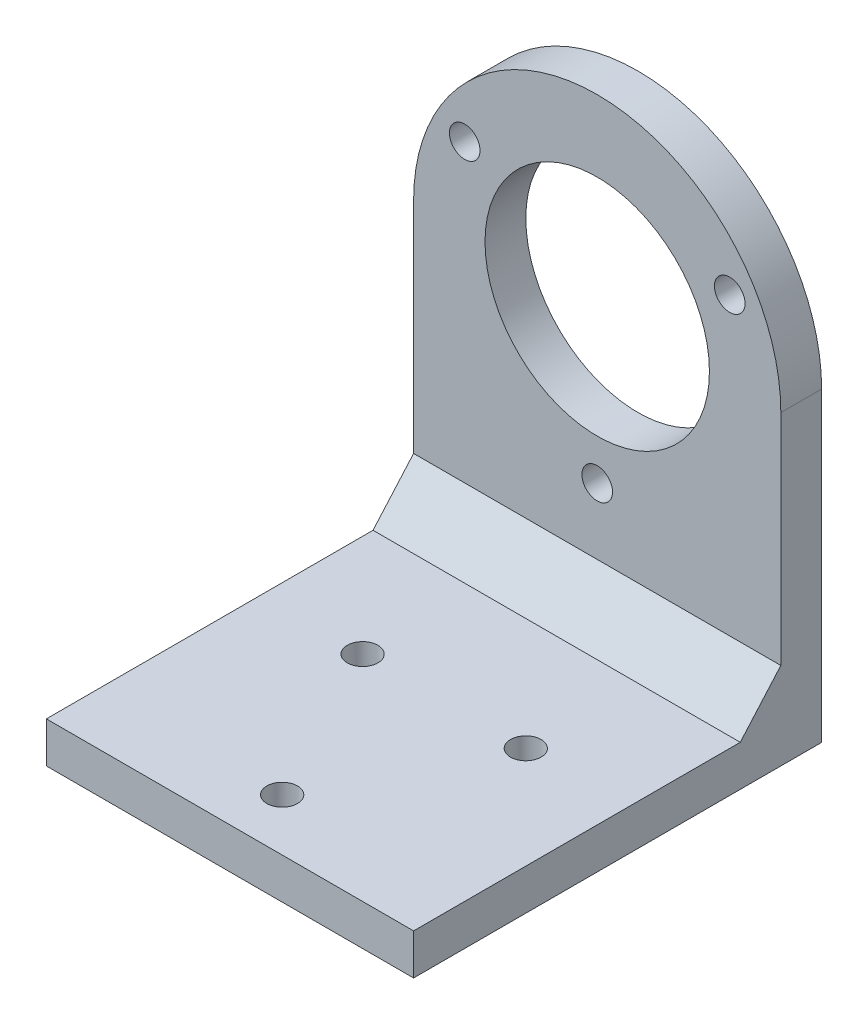
ISO-10303-21;
HEADER;
FILE_DESCRIPTION(('STEP AP214'),'2;1');
FILE_NAME('part.step','',(''),(''),'','','');
FILE_SCHEMA(('AUTOMOTIVE_DESIGN { 1 0 10303 214 1 1 1 1 }'));
ENDSEC;
DATA;
#1=APPLICATION_CONTEXT('core data for automotive mechanical design processes');
#2=APPLICATION_PROTOCOL_DEFINITION('international standard','automotive_design',2000,#1);
#3=PRODUCT_CONTEXT('',#1,'mechanical');
#4=PRODUCT('Part','Part','',(#3));
#5=PRODUCT_RELATED_PRODUCT_CATEGORY('part','',(#4));
#6=PRODUCT_DEFINITION_FORMATION('','',#4);
#7=PRODUCT_DEFINITION_CONTEXT('part definition',#1,'design');
#8=PRODUCT_DEFINITION('design','',#6,#7);
#9=PRODUCT_DEFINITION_SHAPE('','',#8);
#10=(LENGTH_UNIT() NAMED_UNIT(*) SI_UNIT(.MILLI.,.METRE.));
#11=(NAMED_UNIT(*) PLANE_ANGLE_UNIT() SI_UNIT($,.RADIAN.));
#12=(NAMED_UNIT(*) SI_UNIT($,.STERADIAN.) SOLID_ANGLE_UNIT());
#13=UNCERTAINTY_MEASURE_WITH_UNIT(LENGTH_MEASURE(1.E-05),#10,'distance_accuracy_value','');
#14=(GEOMETRIC_REPRESENTATION_CONTEXT(3) GLOBAL_UNCERTAINTY_ASSIGNED_CONTEXT((#13)) GLOBAL_UNIT_ASSIGNED_CONTEXT((#10,
#11,#12)) REPRESENTATION_CONTEXT('',''));
#15=CARTESIAN_POINT('',(0.,0.,0.));
#16=DIRECTION('',(0.,0.,1.));
#17=DIRECTION('',(1.,0.,0.));
#18=AXIS2_PLACEMENT_3D('',#15,#16,#17);
#19=CARTESIAN_POINT('',(-20.9003654854601,21.8309232480534,4.));
#20=DIRECTION('',(0.,0.,1.));
#21=DIRECTION('',(1.,0.,0.));
#22=AXIS2_PLACEMENT_3D('',#19,#20,#21);
#23=PLANE('',#22);
#24=DIRECTION('',(1.,0.,0.));
#25=VECTOR('',#24,1.);
#26=CARTESIAN_POINT('',(-38.9003654854601,0.364546522872464,4.));
#27=LINE('',#26,#25);
#28=CARTESIAN_POINT('',(-38.9003654854601,0.364546522872464,4.));
#29=VERTEX_POINT('',#28);
#30=CARTESIAN_POINT('',(-2.90036548546006,0.364546522872471,4.));
#31=VERTEX_POINT('',#30);
#32=EDGE_CURVE('E56',#29,#31,#27,.T.);
#33=ORIENTED_EDGE('',*,*,#32,.T.);
#34=DIRECTION('',(0.,1.,0.));
#35=VECTOR('',#34,1.);
#36=CARTESIAN_POINT('',(-2.90036548546006,21.8309232480534,4.));
#37=LINE('',#36,#35);
#38=CARTESIAN_POINT('',(-2.90036548546006,21.8309232480534,4.));
#39=VERTEX_POINT('',#38);
#40=EDGE_CURVE('E132',#31,#39,#37,.T.);
#41=ORIENTED_EDGE('',*,*,#40,.T.);
#42=CARTESIAN_POINT('',(-20.9003654854601,21.8309232480534,4.));
#43=DIRECTION('',(0.,0.,1.));
#44=DIRECTION('',(1.,0.,0.));
#45=AXIS2_PLACEMENT_3D('',#42,#43,#44);
#46=CIRCLE('',#45,18.);
#47=CARTESIAN_POINT('',(-38.9003654854601,21.8309232480534,4.));
#48=VERTEX_POINT('',#47);
#49=EDGE_CURVE('E128',#39,#48,#46,.T.);
#50=ORIENTED_EDGE('',*,*,#49,.T.);
#51=DIRECTION('',(0.,-1.,0.));
#52=VECTOR('',#51,1.);
#53=CARTESIAN_POINT('',(-38.9003654854601,21.8309232480534,4.));
#54=LINE('',#53,#52);
#55=EDGE_CURVE('E52',#48,#29,#54,.T.);
#56=ORIENTED_EDGE('',*,*,#55,.T.);
#57=EDGE_LOOP('',(#33,#41,#50,#56));
#58=FACE_BOUND('',#57,.T.);
#59=CARTESIAN_POINT('',(-7.90998442869341,29.3309232480533,4.));
#60=DIRECTION('',(0.,0.,1.));
#61=DIRECTION('',(1.,0.,0.));
#62=AXIS2_PLACEMENT_3D('',#59,#60,#61);
#63=CIRCLE('',#62,1.5);
#64=CARTESIAN_POINT('',(-9.40998442869341,29.3309232480533,4.));
#65=VERTEX_POINT('',#64);
#66=EDGE_CURVE('E114',#65,#65,#63,.F.);
#67=ORIENTED_EDGE('',*,*,#66,.T.);
#68=EDGE_LOOP('',(#67));
#69=FACE_BOUND('',#68,.T.);
#70=CARTESIAN_POINT('',(-33.8907465422266,29.3309232480535,4.));
#71=DIRECTION('',(0.,0.,1.));
#72=DIRECTION('',(1.,0.,0.));
#73=AXIS2_PLACEMENT_3D('',#70,#71,#72);
#74=CIRCLE('',#73,1.5);
#75=CARTESIAN_POINT('',(-35.3907465422266,29.3309232480535,4.));
#76=VERTEX_POINT('',#75);
#77=EDGE_CURVE('E184',#76,#76,#74,.F.);
#78=ORIENTED_EDGE('',*,*,#77,.T.);
#79=EDGE_LOOP('',(#78));
#80=FACE_BOUND('',#79,.T.);
#81=CARTESIAN_POINT('',(-20.9003654854601,6.8309232480534,4.));
#82=DIRECTION('',(0.,0.,1.));
#83=DIRECTION('',(1.,0.,0.));
#84=AXIS2_PLACEMENT_3D('',#81,#82,#83);
#85=CIRCLE('',#84,1.5);
#86=CARTESIAN_POINT('',(-22.4003654854601,6.8309232480534,4.));
#87=VERTEX_POINT('',#86);
#88=EDGE_CURVE('E181',#87,#87,#85,.F.);
#89=ORIENTED_EDGE('',*,*,#88,.T.);
#90=EDGE_LOOP('',(#89));
#91=FACE_BOUND('',#90,.T.);
#92=CARTESIAN_POINT('',(-20.9003654854601,21.8309232480534,4.));
#93=DIRECTION('',(0.,0.,1.));
#94=DIRECTION('',(1.,0.,0.));
#95=AXIS2_PLACEMENT_3D('',#92,#93,#94);
#96=CIRCLE('',#95,11.);
#97=CARTESIAN_POINT('',(-31.9003654854601,21.8309232480534,4.));
#98=VERTEX_POINT('',#97);
#99=EDGE_CURVE('E178',#98,#98,#96,.F.);
#100=ORIENTED_EDGE('',*,*,#99,.T.);
#101=EDGE_LOOP('',(#100));
#102=FACE_BOUND('',#101,.T.);
#103=ADVANCED_FACE('F35',(#58,#69,#80,#91,#102),#23,.T.);
#104=CARTESIAN_POINT('',(-20.9003654854601,21.8309232480534,4.));
#105=DIRECTION('',(0.,0.,-1.));
#106=DIRECTION('',(-1.,0.,0.));
#107=AXIS2_PLACEMENT_3D('',#104,#105,#106);
#108=CYLINDRICAL_SURFACE('',#107,18.);
#109=CARTESIAN_POINT('',(-20.9003654854601,21.8309232480534,0.));
#110=DIRECTION('',(0.,0.,1.));
#111=DIRECTION('',(1.,0.,0.));
#112=AXIS2_PLACEMENT_3D('',#109,#110,#111);
#113=CIRCLE('',#112,18.);
#114=CARTESIAN_POINT('',(-2.90036548546006,21.8309232480534,0.));
#115=VERTEX_POINT('',#114);
#116=CARTESIAN_POINT('',(-38.9003654854601,21.8309232480534,0.));
#117=VERTEX_POINT('',#116);
#118=EDGE_CURVE('E120',#115,#117,#113,.T.);
#119=ORIENTED_EDGE('',*,*,#118,.T.);
#120=DIRECTION('',(0.,0.,-1.));
#121=VECTOR('',#120,1.);
#122=CARTESIAN_POINT('',(-38.9003654854601,21.8309232480534,4.));
#123=LINE('',#122,#121);
#124=EDGE_CURVE('E11',#48,#117,#123,.T.);
#125=ORIENTED_EDGE('',*,*,#124,.F.);
#126=ORIENTED_EDGE('',*,*,#49,.F.);
#127=DIRECTION('',(0.,0.,-1.));
#128=VECTOR('',#127,1.);
#129=CARTESIAN_POINT('',(-2.90036548546006,21.8309232480534,4.));
#130=LINE('',#129,#128);
#131=EDGE_CURVE('E133',#39,#115,#130,.T.);
#132=ORIENTED_EDGE('',*,*,#131,.T.);
#133=EDGE_LOOP('',(#119,#125,#126,#132));
#134=FACE_BOUND('',#133,.T.);
#135=ADVANCED_FACE('F37',(#134),#108,.T.);
#136=CARTESIAN_POINT('',(-38.9003654854601,21.8309232480534,4.));
#137=DIRECTION('',(1.,0.,0.));
#138=DIRECTION('',(0.,0.,-1.));
#139=AXIS2_PLACEMENT_3D('',#136,#137,#138);
#140=PLANE('',#139);
#141=DIRECTION('',(0.,-0.751667643187152,0.659542079162105));
#142=VECTOR('',#141,1.);
#143=CARTESIAN_POINT('',(-38.9003654854601,0.364546522872464,4.));
#144=LINE('',#143,#142);
#145=CARTESIAN_POINT('',(-38.9003654854601,-4.1690767519466,7.97797530319846));
#146=VERTEX_POINT('',#145);
#147=EDGE_CURVE('E205',#29,#146,#144,.T.);
#148=ORIENTED_EDGE('',*,*,#147,.F.);
#149=ORIENTED_EDGE('',*,*,#55,.F.);
#150=ORIENTED_EDGE('',*,*,#124,.T.);
#151=DIRECTION('',(0.,-1.,0.));
#152=VECTOR('',#151,1.);
#153=CARTESIAN_POINT('',(-38.9003654854601,21.8309232480534,0.));
#154=LINE('',#153,#152);
#155=CARTESIAN_POINT('',(-38.9003654854601,-8.1690767519466,0.));
#156=VERTEX_POINT('',#155);
#157=EDGE_CURVE('E123',#117,#156,#154,.T.);
#158=ORIENTED_EDGE('',*,*,#157,.T.);
#159=DIRECTION('',(0.,0.,-1.));
#160=VECTOR('',#159,1.);
#161=CARTESIAN_POINT('',(-38.9003654854601,-8.1690767519466,4.));
#162=LINE('',#161,#160);
#163=CARTESIAN_POINT('',(-38.9003654854601,-8.1690767519466,40.));
#164=VERTEX_POINT('',#163);
#165=EDGE_CURVE('E44',#164,#156,#162,.T.);
#166=ORIENTED_EDGE('',*,*,#165,.F.);
#167=DIRECTION('',(0.,-1.,0.));
#168=VECTOR('',#167,1.);
#169=CARTESIAN_POINT('',(-38.9003654854601,-8.1690767519466,40.));
#170=LINE('',#169,#168);
#171=CARTESIAN_POINT('',(-38.9003654854601,-4.1690767519466,40.));
#172=VERTEX_POINT('',#171);
#173=EDGE_CURVE('E104',#172,#164,#170,.T.);
#174=ORIENTED_EDGE('',*,*,#173,.F.);
#175=DIRECTION('',(0.,0.,-1.));
#176=VECTOR('',#175,1.);
#177=CARTESIAN_POINT('',(-38.9003654854601,-4.1690767519466,40.));
#178=LINE('',#177,#176);
#179=EDGE_CURVE('E100',#172,#146,#178,.T.);
#180=ORIENTED_EDGE('',*,*,#179,.T.);
#181=EDGE_LOOP('',(#148,#149,#150,#158,#166,#174,#180));
#182=FACE_BOUND('',#181,.T.);
#183=ADVANCED_FACE('F208',(#182),#140,.F.);
#184=CARTESIAN_POINT('',(-38.9003654854601,-8.1690767519466,4.));
#185=DIRECTION('',(0.,1.,0.));
#186=DIRECTION('',(0.,0.,1.));
#187=AXIS2_PLACEMENT_3D('',#184,#185,#186);
#188=PLANE('',#187);
#189=CARTESIAN_POINT('',(-12.9003654854601,-8.1690767519466,19.));
#190=DIRECTION('',(0.,1.,0.));
#191=DIRECTION('',(0.,0.,1.));
#192=AXIS2_PLACEMENT_3D('',#189,#190,#191);
#193=CIRCLE('',#192,1.5);
#194=CARTESIAN_POINT('',(-12.9003654854601,-8.1690767519466,20.5));
#195=VERTEX_POINT('',#194);
#196=EDGE_CURVE('E163',#195,#195,#193,.T.);
#197=ORIENTED_EDGE('',*,*,#196,.T.);
#198=EDGE_LOOP('',(#197));
#199=FACE_BOUND('',#198,.T.);
#200=CARTESIAN_POINT('',(-20.90036548546,-8.1690767519466,34.884));
#201=DIRECTION('',(0.,1.,0.));
#202=DIRECTION('',(0.,0.,1.));
#203=AXIS2_PLACEMENT_3D('',#200,#201,#202);
#204=CIRCLE('',#203,1.5);
#205=CARTESIAN_POINT('',(-20.90036548546,-8.1690767519466,36.384));
#206=VERTEX_POINT('',#205);
#207=EDGE_CURVE('E151',#206,#206,#204,.T.);
#208=ORIENTED_EDGE('',*,*,#207,.T.);
#209=EDGE_LOOP('',(#208));
#210=FACE_BOUND('',#209,.T.);
#211=CARTESIAN_POINT('',(-28.90036548546,-8.1690767519466,19.));
#212=DIRECTION('',(0.,1.,0.));
#213=DIRECTION('',(0.,0.,1.));
#214=AXIS2_PLACEMENT_3D('',#211,#212,#213);
#215=CIRCLE('',#214,1.5);
#216=CARTESIAN_POINT('',(-28.90036548546,-8.1690767519466,20.5));
#217=VERTEX_POINT('',#216);
#218=EDGE_CURVE('E147',#217,#217,#215,.T.);
#219=ORIENTED_EDGE('',*,*,#218,.T.);
#220=EDGE_LOOP('',(#219));
#221=FACE_BOUND('',#220,.T.);
#222=DIRECTION('',(1.,0.,0.));
#223=VECTOR('',#222,1.);
#224=CARTESIAN_POINT('',(-38.9003654854601,-8.1690767519466,0.));
#225=LINE('',#224,#223);
#226=CARTESIAN_POINT('',(-2.90036548546006,-8.1690767519466,0.));
#227=VERTEX_POINT('',#226);
#228=EDGE_CURVE('E136',#156,#227,#225,.T.);
#229=ORIENTED_EDGE('',*,*,#228,.T.);
#230=DIRECTION('',(0.,0.,-1.));
#231=VECTOR('',#230,1.);
#232=CARTESIAN_POINT('',(-2.90036548546006,-8.1690767519466,4.));
#233=LINE('',#232,#231);
#234=CARTESIAN_POINT('',(-2.90036548546006,-8.1690767519466,40.));
#235=VERTEX_POINT('',#234);
#236=EDGE_CURVE('E141',#235,#227,#233,.T.);
#237=ORIENTED_EDGE('',*,*,#236,.F.);
#238=DIRECTION('',(1.,0.,0.));
#239=VECTOR('',#238,1.);
#240=CARTESIAN_POINT('',(-2.90036548546006,-8.1690767519466,40.));
#241=LINE('',#240,#239);
#242=EDGE_CURVE('E111',#164,#235,#241,.T.);
#243=ORIENTED_EDGE('',*,*,#242,.F.);
#244=ORIENTED_EDGE('',*,*,#165,.T.);
#245=EDGE_LOOP('',(#229,#237,#243,#244));
#246=FACE_BOUND('',#245,.T.);
#247=ADVANCED_FACE('F191',(#199,#210,#221,#246),#188,.F.);
#248=CARTESIAN_POINT('',(-2.90036548546006,21.8309232480534,4.));
#249=DIRECTION('',(-1.,0.,0.));
#250=DIRECTION('',(0.,-1.,0.));
#251=AXIS2_PLACEMENT_3D('',#248,#249,#250);
#252=PLANE('',#251);
#253=ORIENTED_EDGE('',*,*,#40,.F.);
#254=DIRECTION('',(0.,-0.751667643187152,0.659542079162105));
#255=VECTOR('',#254,1.);
#256=CARTESIAN_POINT('',(-2.90036548546006,0.364546522872472,4.));
#257=LINE('',#256,#255);
#258=CARTESIAN_POINT('',(-2.90036548546006,-4.1690767519466,7.97797530319846));
#259=VERTEX_POINT('',#258);
#260=EDGE_CURVE('E119',#31,#259,#257,.T.);
#261=ORIENTED_EDGE('',*,*,#260,.T.);
#262=DIRECTION('',(0.,0.,-1.));
#263=VECTOR('',#262,1.);
#264=CARTESIAN_POINT('',(-2.90036548546006,-4.1690767519466,40.));
#265=LINE('',#264,#263);
#266=CARTESIAN_POINT('',(-2.90036548546006,-4.1690767519466,40.));
#267=VERTEX_POINT('',#266);
#268=EDGE_CURVE('E97',#267,#259,#265,.T.);
#269=ORIENTED_EDGE('',*,*,#268,.F.);
#270=DIRECTION('',(0.,1.,0.));
#271=VECTOR('',#270,1.);
#272=CARTESIAN_POINT('',(-2.90036548546006,-8.1690767519466,40.));
#273=LINE('',#272,#271);
#274=EDGE_CURVE('E105',#235,#267,#273,.T.);
#275=ORIENTED_EDGE('',*,*,#274,.F.);
#276=ORIENTED_EDGE('',*,*,#236,.T.);
#277=DIRECTION('',(0.,1.,0.));
#278=VECTOR('',#277,1.);
#279=CARTESIAN_POINT('',(-2.90036548546006,21.8309232480534,0.));
#280=LINE('',#279,#278);
#281=EDGE_CURVE('E130',#227,#115,#280,.T.);
#282=ORIENTED_EDGE('',*,*,#281,.T.);
#283=ORIENTED_EDGE('',*,*,#131,.F.);
#284=EDGE_LOOP('',(#253,#261,#269,#275,#276,#282,#283));
#285=FACE_BOUND('',#284,.T.);
#286=ADVANCED_FACE('F117',(#285),#252,.F.);
#287=CARTESIAN_POINT('',(-20.9003654854601,21.8309232480534,0.));
#288=DIRECTION('',(0.,0.,1.));
#289=DIRECTION('',(1.,0.,0.));
#290=AXIS2_PLACEMENT_3D('',#287,#288,#289);
#291=PLANE('',#290);
#292=CARTESIAN_POINT('',(-7.90998442869341,29.3309232480533,0.));
#293=DIRECTION('',(0.,0.,1.));
#294=DIRECTION('',(1.,0.,0.));
#295=AXIS2_PLACEMENT_3D('',#292,#293,#294);
#296=CIRCLE('',#295,1.5);
#297=CARTESIAN_POINT('',(-9.40998442869341,29.3309232480533,0.));
#298=VERTEX_POINT('',#297);
#299=EDGE_CURVE('E166',#298,#298,#296,.T.);
#300=ORIENTED_EDGE('',*,*,#299,.T.);
#301=EDGE_LOOP('',(#300));
#302=FACE_BOUND('',#301,.T.);
#303=CARTESIAN_POINT('',(-33.8907465422266,29.3309232480535,0.));
#304=DIRECTION('',(0.,0.,1.));
#305=DIRECTION('',(1.,0.,0.));
#306=AXIS2_PLACEMENT_3D('',#303,#304,#305);
#307=CIRCLE('',#306,1.5);
#308=CARTESIAN_POINT('',(-35.3907465422266,29.3309232480535,0.));
#309=VERTEX_POINT('',#308);
#310=EDGE_CURVE('E171',#309,#309,#307,.T.);
#311=ORIENTED_EDGE('',*,*,#310,.T.);
#312=EDGE_LOOP('',(#311));
#313=FACE_BOUND('',#312,.T.);
#314=CARTESIAN_POINT('',(-20.9003654854601,6.8309232480534,0.));
#315=DIRECTION('',(0.,0.,1.));
#316=DIRECTION('',(1.,0.,0.));
#317=AXIS2_PLACEMENT_3D('',#314,#315,#316);
#318=CIRCLE('',#317,1.5);
#319=CARTESIAN_POINT('',(-22.4003654854601,6.8309232480534,0.));
#320=VERTEX_POINT('',#319);
#321=EDGE_CURVE('E167',#320,#320,#318,.T.);
#322=ORIENTED_EDGE('',*,*,#321,.T.);
#323=EDGE_LOOP('',(#322));
#324=FACE_BOUND('',#323,.T.);
#325=CARTESIAN_POINT('',(-20.9003654854601,21.8309232480534,0.));
#326=DIRECTION('',(0.,0.,1.));
#327=DIRECTION('',(1.,0.,0.));
#328=AXIS2_PLACEMENT_3D('',#325,#326,#327);
#329=CIRCLE('',#328,11.);
#330=CARTESIAN_POINT('',(-31.9003654854601,21.8309232480534,0.));
#331=VERTEX_POINT('',#330);
#332=EDGE_CURVE('E170',#331,#331,#329,.T.);
#333=ORIENTED_EDGE('',*,*,#332,.T.);
#334=EDGE_LOOP('',(#333));
#335=FACE_BOUND('',#334,.T.);
#336=ORIENTED_EDGE('',*,*,#228,.F.);
#337=ORIENTED_EDGE('',*,*,#157,.F.);
#338=ORIENTED_EDGE('',*,*,#118,.F.);
#339=ORIENTED_EDGE('',*,*,#281,.F.);
#340=EDGE_LOOP('',(#336,#337,#338,#339));
#341=FACE_BOUND('',#340,.T.);
#342=ADVANCED_FACE('F197',(#302,#313,#324,#335,#341),#291,.F.);
#343=CARTESIAN_POINT('',(-2.90036548546006,-4.1690767519466,40.));
#344=DIRECTION('',(0.,-1.,0.));
#345=DIRECTION('',(0.,0.,-1.));
#346=AXIS2_PLACEMENT_3D('',#343,#344,#345);
#347=PLANE('',#346);
#348=CARTESIAN_POINT('',(-12.9003654854601,-4.1690767519466,19.));
#349=DIRECTION('',(0.,-1.,0.));
#350=DIRECTION('',(0.,0.,-1.));
#351=AXIS2_PLACEMENT_3D('',#348,#349,#350);
#352=CIRCLE('',#351,1.5);
#353=CARTESIAN_POINT('',(-12.9003654854601,-4.1690767519466,17.5));
#354=VERTEX_POINT('',#353);
#355=EDGE_CURVE('E39',#354,#354,#352,.T.);
#356=ORIENTED_EDGE('',*,*,#355,.T.);
#357=EDGE_LOOP('',(#356));
#358=FACE_BOUND('',#357,.T.);
#359=CARTESIAN_POINT('',(-20.90036548546,-4.1690767519466,34.884));
#360=DIRECTION('',(0.,-1.,0.));
#361=DIRECTION('',(0.,0.,-1.));
#362=AXIS2_PLACEMENT_3D('',#359,#360,#361);
#363=CIRCLE('',#362,1.5);
#364=CARTESIAN_POINT('',(-20.90036548546,-4.1690767519466,33.384));
#365=VERTEX_POINT('',#364);
#366=EDGE_CURVE('E149',#365,#365,#363,.T.);
#367=ORIENTED_EDGE('',*,*,#366,.T.);
#368=EDGE_LOOP('',(#367));
#369=FACE_BOUND('',#368,.T.);
#370=CARTESIAN_POINT('',(-28.90036548546,-4.1690767519466,19.));
#371=DIRECTION('',(0.,-1.,0.));
#372=DIRECTION('',(0.,0.,-1.));
#373=AXIS2_PLACEMENT_3D('',#370,#371,#372);
#374=CIRCLE('',#373,1.5);
#375=CARTESIAN_POINT('',(-28.90036548546,-4.1690767519466,17.5));
#376=VERTEX_POINT('',#375);
#377=EDGE_CURVE('E145',#376,#376,#374,.T.);
#378=ORIENTED_EDGE('',*,*,#377,.T.);
#379=EDGE_LOOP('',(#378));
#380=FACE_BOUND('',#379,.T.);
#381=ORIENTED_EDGE('',*,*,#268,.T.);
#382=DIRECTION('',(1.,0.,0.));
#383=VECTOR('',#382,1.);
#384=CARTESIAN_POINT('',(-38.9003654854601,-4.16907675194661,7.97797530319846));
#385=LINE('',#384,#383);
#386=EDGE_CURVE('E148',#146,#259,#385,.T.);
#387=ORIENTED_EDGE('',*,*,#386,.F.);
#388=ORIENTED_EDGE('',*,*,#179,.F.);
#389=DIRECTION('',(-1.,0.,0.));
#390=VECTOR('',#389,1.);
#391=CARTESIAN_POINT('',(-2.90036548546006,-4.1690767519466,40.));
#392=LINE('',#391,#390);
#393=EDGE_CURVE('E93',#267,#172,#392,.T.);
#394=ORIENTED_EDGE('',*,*,#393,.F.);
#395=EDGE_LOOP('',(#381,#387,#388,#394));
#396=FACE_BOUND('',#395,.T.);
#397=ADVANCED_FACE('F95',(#358,#369,#380,#396),#347,.F.);
#398=CARTESIAN_POINT('',(0.,0.,40.));
#399=DIRECTION('',(0.,0.,1.));
#400=DIRECTION('',(1.,0.,0.));
#401=AXIS2_PLACEMENT_3D('',#398,#399,#400);
#402=PLANE('',#401);
#403=ORIENTED_EDGE('',*,*,#274,.T.);
#404=ORIENTED_EDGE('',*,*,#393,.T.);
#405=ORIENTED_EDGE('',*,*,#173,.T.);
#406=ORIENTED_EDGE('',*,*,#242,.T.);
#407=EDGE_LOOP('',(#403,#404,#405,#406));
#408=FACE_BOUND('',#407,.T.);
#409=ADVANCED_FACE('F109',(#408),#402,.T.);
#410=CARTESIAN_POINT('',(-20.9003654854601,21.8309232480534,22.));
#411=DIRECTION('',(0.,0.,-1.));
#412=DIRECTION('',(-1.,0.,0.));
#413=AXIS2_PLACEMENT_3D('',#410,#411,#412);
#414=CYLINDRICAL_SURFACE('',#413,11.);
#415=CARTESIAN_POINT('',(-31.9003654854601,21.8309232480534,4.));
#416=CARTESIAN_POINT('',(-31.9003654854601,21.8309232480534,3.95833333333333));
#417=CARTESIAN_POINT('',(-31.9003654854601,21.8309232480534,3.91666666666667));
#418=CARTESIAN_POINT('',(-31.9003654854601,21.8309232480534,3.83333333333333));
#419=CARTESIAN_POINT('',(-31.9003654854601,21.8309232480534,3.79166666666667));
#420=CARTESIAN_POINT('',(-31.9003654854601,21.8309232480534,3.70833333333333));
#421=CARTESIAN_POINT('',(-31.9003654854601,21.8309232480534,3.66666666666667));
#422=CARTESIAN_POINT('',(-31.9003654854601,21.8309232480534,3.58333333333333));
#423=CARTESIAN_POINT('',(-31.9003654854601,21.8309232480534,3.54166666666667));
#424=CARTESIAN_POINT('',(-31.9003654854601,21.8309232480534,3.45833333333333));
#425=CARTESIAN_POINT('',(-31.9003654854601,21.8309232480534,3.41666666666667));
#426=CARTESIAN_POINT('',(-31.9003654854601,21.8309232480534,3.33333333333333));
#427=CARTESIAN_POINT('',(-31.9003654854601,21.8309232480534,3.29166666666667));
#428=CARTESIAN_POINT('',(-31.9003654854601,21.8309232480534,3.20833333333333));
#429=CARTESIAN_POINT('',(-31.9003654854601,21.8309232480534,3.16666666666667));
#430=CARTESIAN_POINT('',(-31.9003654854601,21.8309232480534,3.08333333333333));
#431=CARTESIAN_POINT('',(-31.9003654854601,21.8309232480534,3.04166666666667));
#432=CARTESIAN_POINT('',(-31.9003654854601,21.8309232480534,2.95833333333333));
#433=CARTESIAN_POINT('',(-31.9003654854601,21.8309232480534,2.91666666666667));
#434=CARTESIAN_POINT('',(-31.9003654854601,21.8309232480534,2.83333333333333));
#435=CARTESIAN_POINT('',(-31.9003654854601,21.8309232480534,2.79166666666667));
#436=CARTESIAN_POINT('',(-31.9003654854601,21.8309232480534,2.70833333333333));
#437=CARTESIAN_POINT('',(-31.9003654854601,21.8309232480534,2.66666666666667));
#438=CARTESIAN_POINT('',(-31.9003654854601,21.8309232480534,2.58333333333333));
#439=CARTESIAN_POINT('',(-31.9003654854601,21.8309232480534,2.54166666666667));
#440=CARTESIAN_POINT('',(-31.9003654854601,21.8309232480534,2.45833333333333));
#441=CARTESIAN_POINT('',(-31.9003654854601,21.8309232480534,2.41666666666667));
#442=CARTESIAN_POINT('',(-31.9003654854601,21.8309232480534,2.33333333333333));
#443=CARTESIAN_POINT('',(-31.9003654854601,21.8309232480534,2.29166666666667));
#444=CARTESIAN_POINT('',(-31.9003654854601,21.8309232480534,2.20833333333333));
#445=CARTESIAN_POINT('',(-31.9003654854601,21.8309232480534,2.16666666666667));
#446=CARTESIAN_POINT('',(-31.9003654854601,21.8309232480534,2.08333333333333));
#447=CARTESIAN_POINT('',(-31.9003654854601,21.8309232480534,2.04166666666667));
#448=CARTESIAN_POINT('',(-31.9003654854601,21.8309232480534,1.95833333333333));
#449=CARTESIAN_POINT('',(-31.9003654854601,21.8309232480534,1.91666666666666));
#450=CARTESIAN_POINT('',(-31.9003654854601,21.8309232480534,1.83333333333333));
#451=CARTESIAN_POINT('',(-31.9003654854601,21.8309232480534,1.79166666666666));
#452=CARTESIAN_POINT('',(-31.9003654854601,21.8309232480534,1.70833333333333));
#453=CARTESIAN_POINT('',(-31.9003654854601,21.8309232480534,1.66666666666666));
#454=CARTESIAN_POINT('',(-31.9003654854601,21.8309232480534,1.58333333333333));
#455=CARTESIAN_POINT('',(-31.9003654854601,21.8309232480534,1.54166666666666));
#456=CARTESIAN_POINT('',(-31.9003654854601,21.8309232480534,1.45833333333333));
#457=CARTESIAN_POINT('',(-31.9003654854601,21.8309232480534,1.41666666666666));
#458=CARTESIAN_POINT('',(-31.9003654854601,21.8309232480534,1.33333333333333));
#459=CARTESIAN_POINT('',(-31.9003654854601,21.8309232480534,1.29166666666666));
#460=CARTESIAN_POINT('',(-31.9003654854601,21.8309232480534,1.20833333333333));
#461=CARTESIAN_POINT('',(-31.9003654854601,21.8309232480534,1.16666666666666));
#462=CARTESIAN_POINT('',(-31.9003654854601,21.8309232480534,1.08333333333333));
#463=CARTESIAN_POINT('',(-31.9003654854601,21.8309232480534,1.04166666666666));
#464=CARTESIAN_POINT('',(-31.9003654854601,21.8309232480534,0.958333333333331));
#465=CARTESIAN_POINT('',(-31.9003654854601,21.8309232480534,0.916666666666664));
#466=CARTESIAN_POINT('',(-31.9003654854601,21.8309232480534,0.833333333333331));
#467=CARTESIAN_POINT('',(-31.9003654854601,21.8309232480534,0.791666666666664));
#468=CARTESIAN_POINT('',(-31.9003654854601,21.8309232480534,0.70833333333333));
#469=CARTESIAN_POINT('',(-31.9003654854601,21.8309232480534,0.666666666666664));
#470=CARTESIAN_POINT('',(-31.9003654854601,21.8309232480534,0.58333333333333));
#471=CARTESIAN_POINT('',(-31.9003654854601,21.8309232480534,0.541666666666664));
#472=CARTESIAN_POINT('',(-31.9003654854601,21.8309232480534,0.45833333333333));
#473=CARTESIAN_POINT('',(-31.9003654854601,21.8309232480534,0.416666666666664));
#474=CARTESIAN_POINT('',(-31.9003654854601,21.8309232480534,0.33333333333333));
#475=CARTESIAN_POINT('',(-31.9003654854601,21.8309232480534,0.291666666666663));
#476=CARTESIAN_POINT('',(-31.9003654854601,21.8309232480534,0.20833333333333));
#477=CARTESIAN_POINT('',(-31.9003654854601,21.8309232480534,0.166666666666663));
#478=CARTESIAN_POINT('',(-31.9003654854601,21.8309232480534,0.0833333333333299));
#479=CARTESIAN_POINT('',(-31.9003654854601,21.8309232480534,0.0416666666666632));
#480=CARTESIAN_POINT('',(-31.9003654854601,21.8309232480534,0.));
#481=B_SPLINE_CURVE_WITH_KNOTS('',3,(#415,#416,#417,#418,#419,#420,#421,#422,#423,#424,#425,
#426,#427,#428,#429,#430,#431,#432,#433,#434,#435,#436,#437,#438,#439,#440,#441,#442,#443,#444,
#445,#446,#447,#448,#449,#450,#451,#452,#453,#454,#455,#456,#457,#458,#459,#460,#461,#462,#463,
#464,#465,#466,#467,#468,#469,#470,#471,#472,#473,#474,#475,#476,#477,#478,#479,#480),
.UNSPECIFIED.,.F.,.F.,(4,2,2,2,2,2,2,2,2,2,2,2,2,2,2,2,2,2,2,2,2,2,2,2,2,2,2,2,2,2,2,2,4),(0.,
0.125,0.25,0.375,0.5,0.625000000000001,0.750000000000001,0.875000000000001,1.,1.125,1.25,1.375,
1.5,1.625,1.75,1.875,2.,2.125,2.25,2.375,2.5,2.625,2.75,2.875,3.,3.125,3.25,3.375,3.5,3.625,
3.75,3.875,4.),.UNSPECIFIED.);
#482=EDGE_CURVE('BSEAM220',#98,#331,#481,.T.);
#483=ORIENTED_EDGE('',*,*,#99,.F.);
#484=ORIENTED_EDGE('',*,*,#332,.F.);
#485=ORIENTED_EDGE('',*,*,#482,.T.);
#486=ORIENTED_EDGE('',*,*,#482,.F.);
#487=EDGE_LOOP('',(#483,#485,#484,#486));
#488=FACE_BOUND('',#487,.T.);
#489=ADVANCED_FACE('F220',(#488),#414,.F.);
#490=CARTESIAN_POINT('',(-20.9003654854601,6.8309232480534,22.));
#491=DIRECTION('',(0.,0.,-1.));
#492=DIRECTION('',(-1.,0.,0.));
#493=AXIS2_PLACEMENT_3D('',#490,#491,#492);
#494=CYLINDRICAL_SURFACE('',#493,1.5);
#495=CARTESIAN_POINT('',(-22.4003654854601,6.8309232480534,4.));
#496=CARTESIAN_POINT('',(-22.4003654854601,6.8309232480534,3.95833333333333));
#497=CARTESIAN_POINT('',(-22.4003654854601,6.8309232480534,3.91666666666667));
#498=CARTESIAN_POINT('',(-22.4003654854601,6.8309232480534,3.83333333333333));
#499=CARTESIAN_POINT('',(-22.4003654854601,6.8309232480534,3.79166666666667));
#500=CARTESIAN_POINT('',(-22.4003654854601,6.8309232480534,3.70833333333333));
#501=CARTESIAN_POINT('',(-22.4003654854601,6.8309232480534,3.66666666666667));
#502=CARTESIAN_POINT('',(-22.4003654854601,6.8309232480534,3.58333333333333));
#503=CARTESIAN_POINT('',(-22.4003654854601,6.8309232480534,3.54166666666667));
#504=CARTESIAN_POINT('',(-22.4003654854601,6.8309232480534,3.45833333333333));
#505=CARTESIAN_POINT('',(-22.4003654854601,6.8309232480534,3.41666666666667));
#506=CARTESIAN_POINT('',(-22.4003654854601,6.8309232480534,3.33333333333333));
#507=CARTESIAN_POINT('',(-22.4003654854601,6.8309232480534,3.29166666666667));
#508=CARTESIAN_POINT('',(-22.4003654854601,6.8309232480534,3.20833333333333));
#509=CARTESIAN_POINT('',(-22.4003654854601,6.8309232480534,3.16666666666667));
#510=CARTESIAN_POINT('',(-22.4003654854601,6.8309232480534,3.08333333333333));
#511=CARTESIAN_POINT('',(-22.4003654854601,6.8309232480534,3.04166666666667));
#512=CARTESIAN_POINT('',(-22.4003654854601,6.8309232480534,2.95833333333333));
#513=CARTESIAN_POINT('',(-22.4003654854601,6.8309232480534,2.91666666666667));
#514=CARTESIAN_POINT('',(-22.4003654854601,6.8309232480534,2.83333333333333));
#515=CARTESIAN_POINT('',(-22.4003654854601,6.8309232480534,2.79166666666667));
#516=CARTESIAN_POINT('',(-22.4003654854601,6.8309232480534,2.70833333333333));
#517=CARTESIAN_POINT('',(-22.4003654854601,6.8309232480534,2.66666666666667));
#518=CARTESIAN_POINT('',(-22.4003654854601,6.8309232480534,2.58333333333333));
#519=CARTESIAN_POINT('',(-22.4003654854601,6.8309232480534,2.54166666666667));
#520=CARTESIAN_POINT('',(-22.4003654854601,6.8309232480534,2.45833333333333));
#521=CARTESIAN_POINT('',(-22.4003654854601,6.8309232480534,2.41666666666667));
#522=CARTESIAN_POINT('',(-22.4003654854601,6.8309232480534,2.33333333333333));
#523=CARTESIAN_POINT('',(-22.4003654854601,6.8309232480534,2.29166666666667));
#524=CARTESIAN_POINT('',(-22.4003654854601,6.8309232480534,2.20833333333333));
#525=CARTESIAN_POINT('',(-22.4003654854601,6.8309232480534,2.16666666666667));
#526=CARTESIAN_POINT('',(-22.4003654854601,6.8309232480534,2.08333333333333));
#527=CARTESIAN_POINT('',(-22.4003654854601,6.8309232480534,2.04166666666667));
#528=CARTESIAN_POINT('',(-22.4003654854601,6.8309232480534,1.95833333333333));
#529=CARTESIAN_POINT('',(-22.4003654854601,6.8309232480534,1.91666666666666));
#530=CARTESIAN_POINT('',(-22.4003654854601,6.8309232480534,1.83333333333333));
#531=CARTESIAN_POINT('',(-22.4003654854601,6.8309232480534,1.79166666666666));
#532=CARTESIAN_POINT('',(-22.4003654854601,6.8309232480534,1.70833333333333));
#533=CARTESIAN_POINT('',(-22.4003654854601,6.8309232480534,1.66666666666666));
#534=CARTESIAN_POINT('',(-22.4003654854601,6.8309232480534,1.58333333333333));
#535=CARTESIAN_POINT('',(-22.4003654854601,6.8309232480534,1.54166666666666));
#536=CARTESIAN_POINT('',(-22.4003654854601,6.8309232480534,1.45833333333333));
#537=CARTESIAN_POINT('',(-22.4003654854601,6.8309232480534,1.41666666666666));
#538=CARTESIAN_POINT('',(-22.4003654854601,6.8309232480534,1.33333333333333));
#539=CARTESIAN_POINT('',(-22.4003654854601,6.8309232480534,1.29166666666666));
#540=CARTESIAN_POINT('',(-22.4003654854601,6.8309232480534,1.20833333333333));
#541=CARTESIAN_POINT('',(-22.4003654854601,6.8309232480534,1.16666666666666));
#542=CARTESIAN_POINT('',(-22.4003654854601,6.8309232480534,1.08333333333333));
#543=CARTESIAN_POINT('',(-22.4003654854601,6.8309232480534,1.04166666666666));
#544=CARTESIAN_POINT('',(-22.4003654854601,6.8309232480534,0.958333333333331));
#545=CARTESIAN_POINT('',(-22.4003654854601,6.8309232480534,0.916666666666664));
#546=CARTESIAN_POINT('',(-22.4003654854601,6.8309232480534,0.833333333333331));
#547=CARTESIAN_POINT('',(-22.4003654854601,6.8309232480534,0.791666666666664));
#548=CARTESIAN_POINT('',(-22.4003654854601,6.8309232480534,0.70833333333333));
#549=CARTESIAN_POINT('',(-22.4003654854601,6.8309232480534,0.666666666666664));
#550=CARTESIAN_POINT('',(-22.4003654854601,6.8309232480534,0.58333333333333));
#551=CARTESIAN_POINT('',(-22.4003654854601,6.8309232480534,0.541666666666664));
#552=CARTESIAN_POINT('',(-22.4003654854601,6.8309232480534,0.45833333333333));
#553=CARTESIAN_POINT('',(-22.4003654854601,6.8309232480534,0.416666666666664));
#554=CARTESIAN_POINT('',(-22.4003654854601,6.8309232480534,0.33333333333333));
#555=CARTESIAN_POINT('',(-22.4003654854601,6.8309232480534,0.291666666666663));
#556=CARTESIAN_POINT('',(-22.4003654854601,6.8309232480534,0.20833333333333));
#557=CARTESIAN_POINT('',(-22.4003654854601,6.8309232480534,0.166666666666663));
#558=CARTESIAN_POINT('',(-22.4003654854601,6.8309232480534,0.0833333333333299));
#559=CARTESIAN_POINT('',(-22.4003654854601,6.8309232480534,0.0416666666666632));
#560=CARTESIAN_POINT('',(-22.4003654854601,6.8309232480534,0.));
#561=B_SPLINE_CURVE_WITH_KNOTS('',3,(#495,#496,#497,#498,#499,#500,#501,#502,#503,#504,#505,
#506,#507,#508,#509,#510,#511,#512,#513,#514,#515,#516,#517,#518,#519,#520,#521,#522,#523,#524,
#525,#526,#527,#528,#529,#530,#531,#532,#533,#534,#535,#536,#537,#538,#539,#540,#541,#542,#543,
#544,#545,#546,#547,#548,#549,#550,#551,#552,#553,#554,#555,#556,#557,#558,#559,#560),
.UNSPECIFIED.,.F.,.F.,(4,2,2,2,2,2,2,2,2,2,2,2,2,2,2,2,2,2,2,2,2,2,2,2,2,2,2,2,2,2,2,2,4),(0.,
0.125,0.25,0.375,0.5,0.625000000000001,0.750000000000001,0.875000000000001,1.,1.125,1.25,1.375,
1.5,1.625,1.75,1.875,2.,2.125,2.25,2.375,2.5,2.625,2.75,2.875,3.,3.125,3.25,3.375,3.5,3.625,
3.75,3.875,4.),.UNSPECIFIED.);
#562=EDGE_CURVE('BSEAM223',#87,#320,#561,.T.);
#563=ORIENTED_EDGE('',*,*,#88,.F.);
#564=ORIENTED_EDGE('',*,*,#321,.F.);
#565=ORIENTED_EDGE('',*,*,#562,.T.);
#566=ORIENTED_EDGE('',*,*,#562,.F.);
#567=EDGE_LOOP('',(#563,#565,#564,#566));
#568=FACE_BOUND('',#567,.T.);
#569=ADVANCED_FACE('F223',(#568),#494,.F.);
#570=CARTESIAN_POINT('',(-33.8907465422266,29.3309232480535,22.));
#571=DIRECTION('',(0.,0.,-1.));
#572=DIRECTION('',(-1.,0.,0.));
#573=AXIS2_PLACEMENT_3D('',#570,#571,#572);
#574=CYLINDRICAL_SURFACE('',#573,1.5);
#575=CARTESIAN_POINT('',(-35.3907465422266,29.3309232480535,4.));
#576=CARTESIAN_POINT('',(-35.3907465422266,29.3309232480535,3.95833333333333));
#577=CARTESIAN_POINT('',(-35.3907465422266,29.3309232480535,3.91666666666667));
#578=CARTESIAN_POINT('',(-35.3907465422266,29.3309232480535,3.83333333333333));
#579=CARTESIAN_POINT('',(-35.3907465422266,29.3309232480535,3.79166666666667));
#580=CARTESIAN_POINT('',(-35.3907465422266,29.3309232480535,3.70833333333333));
#581=CARTESIAN_POINT('',(-35.3907465422266,29.3309232480535,3.66666666666667));
#582=CARTESIAN_POINT('',(-35.3907465422266,29.3309232480535,3.58333333333333));
#583=CARTESIAN_POINT('',(-35.3907465422266,29.3309232480535,3.54166666666667));
#584=CARTESIAN_POINT('',(-35.3907465422266,29.3309232480535,3.45833333333333));
#585=CARTESIAN_POINT('',(-35.3907465422266,29.3309232480535,3.41666666666667));
#586=CARTESIAN_POINT('',(-35.3907465422266,29.3309232480535,3.33333333333333));
#587=CARTESIAN_POINT('',(-35.3907465422266,29.3309232480535,3.29166666666667));
#588=CARTESIAN_POINT('',(-35.3907465422266,29.3309232480535,3.20833333333333));
#589=CARTESIAN_POINT('',(-35.3907465422266,29.3309232480535,3.16666666666667));
#590=CARTESIAN_POINT('',(-35.3907465422266,29.3309232480535,3.08333333333333));
#591=CARTESIAN_POINT('',(-35.3907465422266,29.3309232480535,3.04166666666667));
#592=CARTESIAN_POINT('',(-35.3907465422266,29.3309232480535,2.95833333333333));
#593=CARTESIAN_POINT('',(-35.3907465422266,29.3309232480535,2.91666666666667));
#594=CARTESIAN_POINT('',(-35.3907465422266,29.3309232480535,2.83333333333333));
#595=CARTESIAN_POINT('',(-35.3907465422266,29.3309232480535,2.79166666666667));
#596=CARTESIAN_POINT('',(-35.3907465422266,29.3309232480535,2.70833333333333));
#597=CARTESIAN_POINT('',(-35.3907465422266,29.3309232480535,2.66666666666667));
#598=CARTESIAN_POINT('',(-35.3907465422266,29.3309232480535,2.58333333333333));
#599=CARTESIAN_POINT('',(-35.3907465422266,29.3309232480535,2.54166666666667));
#600=CARTESIAN_POINT('',(-35.3907465422266,29.3309232480535,2.45833333333333));
#601=CARTESIAN_POINT('',(-35.3907465422266,29.3309232480535,2.41666666666667));
#602=CARTESIAN_POINT('',(-35.3907465422266,29.3309232480535,2.33333333333333));
#603=CARTESIAN_POINT('',(-35.3907465422266,29.3309232480535,2.29166666666667));
#604=CARTESIAN_POINT('',(-35.3907465422266,29.3309232480535,2.20833333333333));
#605=CARTESIAN_POINT('',(-35.3907465422266,29.3309232480535,2.16666666666667));
#606=CARTESIAN_POINT('',(-35.3907465422266,29.3309232480535,2.08333333333333));
#607=CARTESIAN_POINT('',(-35.3907465422266,29.3309232480535,2.04166666666667));
#608=CARTESIAN_POINT('',(-35.3907465422266,29.3309232480535,1.95833333333333));
#609=CARTESIAN_POINT('',(-35.3907465422266,29.3309232480535,1.91666666666666));
#610=CARTESIAN_POINT('',(-35.3907465422266,29.3309232480535,1.83333333333333));
#611=CARTESIAN_POINT('',(-35.3907465422266,29.3309232480535,1.79166666666666));
#612=CARTESIAN_POINT('',(-35.3907465422266,29.3309232480535,1.70833333333333));
#613=CARTESIAN_POINT('',(-35.3907465422266,29.3309232480535,1.66666666666666));
#614=CARTESIAN_POINT('',(-35.3907465422266,29.3309232480535,1.58333333333333));
#615=CARTESIAN_POINT('',(-35.3907465422266,29.3309232480535,1.54166666666666));
#616=CARTESIAN_POINT('',(-35.3907465422266,29.3309232480535,1.45833333333333));
#617=CARTESIAN_POINT('',(-35.3907465422266,29.3309232480535,1.41666666666666));
#618=CARTESIAN_POINT('',(-35.3907465422266,29.3309232480535,1.33333333333333));
#619=CARTESIAN_POINT('',(-35.3907465422266,29.3309232480535,1.29166666666666));
#620=CARTESIAN_POINT('',(-35.3907465422266,29.3309232480535,1.20833333333333));
#621=CARTESIAN_POINT('',(-35.3907465422266,29.3309232480535,1.16666666666666));
#622=CARTESIAN_POINT('',(-35.3907465422266,29.3309232480535,1.08333333333333));
#623=CARTESIAN_POINT('',(-35.3907465422266,29.3309232480535,1.04166666666666));
#624=CARTESIAN_POINT('',(-35.3907465422266,29.3309232480535,0.958333333333331));
#625=CARTESIAN_POINT('',(-35.3907465422266,29.3309232480535,0.916666666666664));
#626=CARTESIAN_POINT('',(-35.3907465422266,29.3309232480535,0.833333333333331));
#627=CARTESIAN_POINT('',(-35.3907465422266,29.3309232480535,0.791666666666664));
#628=CARTESIAN_POINT('',(-35.3907465422266,29.3309232480535,0.70833333333333));
#629=CARTESIAN_POINT('',(-35.3907465422266,29.3309232480535,0.666666666666664));
#630=CARTESIAN_POINT('',(-35.3907465422266,29.3309232480535,0.58333333333333));
#631=CARTESIAN_POINT('',(-35.3907465422266,29.3309232480535,0.541666666666664));
#632=CARTESIAN_POINT('',(-35.3907465422266,29.3309232480535,0.45833333333333));
#633=CARTESIAN_POINT('',(-35.3907465422266,29.3309232480535,0.416666666666664));
#634=CARTESIAN_POINT('',(-35.3907465422266,29.3309232480535,0.33333333333333));
#635=CARTESIAN_POINT('',(-35.3907465422266,29.3309232480535,0.291666666666663));
#636=CARTESIAN_POINT('',(-35.3907465422266,29.3309232480535,0.20833333333333));
#637=CARTESIAN_POINT('',(-35.3907465422266,29.3309232480535,0.166666666666663));
#638=CARTESIAN_POINT('',(-35.3907465422266,29.3309232480535,0.0833333333333299));
#639=CARTESIAN_POINT('',(-35.3907465422266,29.3309232480535,0.0416666666666632));
#640=CARTESIAN_POINT('',(-35.3907465422266,29.3309232480535,0.));
#641=B_SPLINE_CURVE_WITH_KNOTS('',3,(#575,#576,#577,#578,#579,#580,#581,#582,#583,#584,#585,
#586,#587,#588,#589,#590,#591,#592,#593,#594,#595,#596,#597,#598,#599,#600,#601,#602,#603,#604,
#605,#606,#607,#608,#609,#610,#611,#612,#613,#614,#615,#616,#617,#618,#619,#620,#621,#622,#623,
#624,#625,#626,#627,#628,#629,#630,#631,#632,#633,#634,#635,#636,#637,#638,#639,#640),
.UNSPECIFIED.,.F.,.F.,(4,2,2,2,2,2,2,2,2,2,2,2,2,2,2,2,2,2,2,2,2,2,2,2,2,2,2,2,2,2,2,2,4),(0.,
0.125,0.25,0.375,0.5,0.625000000000001,0.750000000000001,0.875000000000001,1.,1.125,1.25,1.375,
1.5,1.625,1.75,1.875,2.,2.125,2.25,2.375,2.5,2.625,2.75,2.875,3.,3.125,3.25,3.375,3.5,3.625,
3.75,3.875,4.),.UNSPECIFIED.);
#642=EDGE_CURVE('BSEAM315',#76,#309,#641,.T.);
#643=ORIENTED_EDGE('',*,*,#77,.F.);
#644=ORIENTED_EDGE('',*,*,#310,.F.);
#645=ORIENTED_EDGE('',*,*,#642,.T.);
#646=ORIENTED_EDGE('',*,*,#642,.F.);
#647=EDGE_LOOP('',(#643,#645,#644,#646));
#648=FACE_BOUND('',#647,.T.);
#649=ADVANCED_FACE('F315',(#648),#574,.F.);
#650=CARTESIAN_POINT('',(-7.90998442869341,29.3309232480533,22.));
#651=DIRECTION('',(0.,0.,-1.));
#652=DIRECTION('',(-1.,0.,0.));
#653=AXIS2_PLACEMENT_3D('',#650,#651,#652);
#654=CYLINDRICAL_SURFACE('',#653,1.5);
#655=CARTESIAN_POINT('',(-9.40998442869341,29.3309232480533,4.));
#656=CARTESIAN_POINT('',(-9.40998442869341,29.3309232480533,3.95833333333333));
#657=CARTESIAN_POINT('',(-9.40998442869341,29.3309232480533,3.91666666666667));
#658=CARTESIAN_POINT('',(-9.40998442869341,29.3309232480533,3.83333333333333));
#659=CARTESIAN_POINT('',(-9.40998442869341,29.3309232480533,3.79166666666667));
#660=CARTESIAN_POINT('',(-9.40998442869341,29.3309232480533,3.70833333333333));
#661=CARTESIAN_POINT('',(-9.40998442869341,29.3309232480533,3.66666666666667));
#662=CARTESIAN_POINT('',(-9.40998442869341,29.3309232480533,3.58333333333333));
#663=CARTESIAN_POINT('',(-9.40998442869341,29.3309232480533,3.54166666666667));
#664=CARTESIAN_POINT('',(-9.40998442869341,29.3309232480533,3.45833333333333));
#665=CARTESIAN_POINT('',(-9.40998442869341,29.3309232480533,3.41666666666667));
#666=CARTESIAN_POINT('',(-9.40998442869341,29.3309232480533,3.33333333333333));
#667=CARTESIAN_POINT('',(-9.40998442869341,29.3309232480533,3.29166666666667));
#668=CARTESIAN_POINT('',(-9.40998442869341,29.3309232480533,3.20833333333333));
#669=CARTESIAN_POINT('',(-9.40998442869341,29.3309232480533,3.16666666666667));
#670=CARTESIAN_POINT('',(-9.40998442869341,29.3309232480533,3.08333333333333));
#671=CARTESIAN_POINT('',(-9.40998442869341,29.3309232480533,3.04166666666667));
#672=CARTESIAN_POINT('',(-9.40998442869341,29.3309232480533,2.95833333333333));
#673=CARTESIAN_POINT('',(-9.40998442869341,29.3309232480533,2.91666666666667));
#674=CARTESIAN_POINT('',(-9.40998442869341,29.3309232480533,2.83333333333333));
#675=CARTESIAN_POINT('',(-9.40998442869341,29.3309232480533,2.79166666666667));
#676=CARTESIAN_POINT('',(-9.40998442869341,29.3309232480533,2.70833333333333));
#677=CARTESIAN_POINT('',(-9.40998442869341,29.3309232480533,2.66666666666667));
#678=CARTESIAN_POINT('',(-9.40998442869341,29.3309232480533,2.58333333333333));
#679=CARTESIAN_POINT('',(-9.40998442869341,29.3309232480533,2.54166666666667));
#680=CARTESIAN_POINT('',(-9.40998442869341,29.3309232480533,2.45833333333333));
#681=CARTESIAN_POINT('',(-9.40998442869341,29.3309232480533,2.41666666666667));
#682=CARTESIAN_POINT('',(-9.40998442869341,29.3309232480533,2.33333333333333));
#683=CARTESIAN_POINT('',(-9.40998442869341,29.3309232480533,2.29166666666667));
#684=CARTESIAN_POINT('',(-9.40998442869341,29.3309232480533,2.20833333333333));
#685=CARTESIAN_POINT('',(-9.40998442869341,29.3309232480533,2.16666666666667));
#686=CARTESIAN_POINT('',(-9.40998442869341,29.3309232480533,2.08333333333333));
#687=CARTESIAN_POINT('',(-9.40998442869341,29.3309232480533,2.04166666666667));
#688=CARTESIAN_POINT('',(-9.40998442869341,29.3309232480533,1.95833333333333));
#689=CARTESIAN_POINT('',(-9.40998442869341,29.3309232480533,1.91666666666666));
#690=CARTESIAN_POINT('',(-9.40998442869341,29.3309232480533,1.83333333333333));
#691=CARTESIAN_POINT('',(-9.40998442869341,29.3309232480533,1.79166666666666));
#692=CARTESIAN_POINT('',(-9.40998442869341,29.3309232480533,1.70833333333333));
#693=CARTESIAN_POINT('',(-9.40998442869341,29.3309232480533,1.66666666666666));
#694=CARTESIAN_POINT('',(-9.40998442869341,29.3309232480533,1.58333333333333));
#695=CARTESIAN_POINT('',(-9.40998442869341,29.3309232480533,1.54166666666666));
#696=CARTESIAN_POINT('',(-9.40998442869341,29.3309232480533,1.45833333333333));
#697=CARTESIAN_POINT('',(-9.40998442869341,29.3309232480533,1.41666666666666));
#698=CARTESIAN_POINT('',(-9.40998442869341,29.3309232480533,1.33333333333333));
#699=CARTESIAN_POINT('',(-9.40998442869341,29.3309232480533,1.29166666666666));
#700=CARTESIAN_POINT('',(-9.40998442869341,29.3309232480533,1.20833333333333));
#701=CARTESIAN_POINT('',(-9.40998442869341,29.3309232480533,1.16666666666666));
#702=CARTESIAN_POINT('',(-9.40998442869341,29.3309232480533,1.08333333333333));
#703=CARTESIAN_POINT('',(-9.40998442869341,29.3309232480533,1.04166666666666));
#704=CARTESIAN_POINT('',(-9.40998442869341,29.3309232480533,0.958333333333331));
#705=CARTESIAN_POINT('',(-9.40998442869341,29.3309232480533,0.916666666666664));
#706=CARTESIAN_POINT('',(-9.40998442869341,29.3309232480533,0.833333333333331));
#707=CARTESIAN_POINT('',(-9.40998442869341,29.3309232480533,0.791666666666664));
#708=CARTESIAN_POINT('',(-9.40998442869341,29.3309232480533,0.70833333333333));
#709=CARTESIAN_POINT('',(-9.40998442869341,29.3309232480533,0.666666666666664));
#710=CARTESIAN_POINT('',(-9.40998442869341,29.3309232480533,0.58333333333333));
#711=CARTESIAN_POINT('',(-9.40998442869341,29.3309232480533,0.541666666666664));
#712=CARTESIAN_POINT('',(-9.40998442869341,29.3309232480533,0.45833333333333));
#713=CARTESIAN_POINT('',(-9.40998442869341,29.3309232480533,0.416666666666664));
#714=CARTESIAN_POINT('',(-9.40998442869341,29.3309232480533,0.33333333333333));
#715=CARTESIAN_POINT('',(-9.40998442869341,29.3309232480533,0.291666666666663));
#716=CARTESIAN_POINT('',(-9.40998442869341,29.3309232480533,0.20833333333333));
#717=CARTESIAN_POINT('',(-9.40998442869341,29.3309232480533,0.166666666666663));
#718=CARTESIAN_POINT('',(-9.40998442869341,29.3309232480533,0.0833333333333299));
#719=CARTESIAN_POINT('',(-9.40998442869341,29.3309232480533,0.0416666666666632));
#720=CARTESIAN_POINT('',(-9.40998442869341,29.3309232480533,0.));
#721=B_SPLINE_CURVE_WITH_KNOTS('',3,(#655,#656,#657,#658,#659,#660,#661,#662,#663,#664,#665,
#666,#667,#668,#669,#670,#671,#672,#673,#674,#675,#676,#677,#678,#679,#680,#681,#682,#683,#684,
#685,#686,#687,#688,#689,#690,#691,#692,#693,#694,#695,#696,#697,#698,#699,#700,#701,#702,#703,
#704,#705,#706,#707,#708,#709,#710,#711,#712,#713,#714,#715,#716,#717,#718,#719,#720),
.UNSPECIFIED.,.F.,.F.,(4,2,2,2,2,2,2,2,2,2,2,2,2,2,2,2,2,2,2,2,2,2,2,2,2,2,2,2,2,2,2,2,4),(0.,
0.125,0.25,0.375,0.5,0.625000000000001,0.750000000000001,0.875000000000001,1.,1.125,1.25,1.375,
1.5,1.625,1.75,1.875,2.,2.125,2.25,2.375,2.5,2.625,2.75,2.875,3.,3.125,3.25,3.375,3.5,3.625,
3.75,3.875,4.),.UNSPECIFIED.);
#722=EDGE_CURVE('BSEAM306',#65,#298,#721,.T.);
#723=ORIENTED_EDGE('',*,*,#66,.F.);
#724=ORIENTED_EDGE('',*,*,#299,.F.);
#725=ORIENTED_EDGE('',*,*,#722,.T.);
#726=ORIENTED_EDGE('',*,*,#722,.F.);
#727=EDGE_LOOP('',(#723,#725,#724,#726));
#728=FACE_BOUND('',#727,.T.);
#729=ADVANCED_FACE('F306',(#728),#654,.F.);
#730=CARTESIAN_POINT('',(-28.90036548546,-10.,19.));
#731=DIRECTION('',(0.,1.,0.));
#732=DIRECTION('',(0.,0.,1.));
#733=AXIS2_PLACEMENT_3D('',#730,#731,#732);
#734=CYLINDRICAL_SURFACE('',#733,1.5);
#735=ORIENTED_EDGE('',*,*,#377,.F.);
#736=EDGE_LOOP('',(#735));
#737=FACE_BOUND('',#736,.T.);
#738=ORIENTED_EDGE('',*,*,#218,.F.);
#739=EDGE_LOOP('',(#738));
#740=FACE_BOUND('',#739,.T.);
#741=ADVANCED_FACE('F298',(#737,#740),#734,.F.);
#742=CARTESIAN_POINT('',(-20.90036548546,-10.,34.884));
#743=DIRECTION('',(0.,1.,0.));
#744=DIRECTION('',(0.,0.,1.));
#745=AXIS2_PLACEMENT_3D('',#742,#743,#744);
#746=CYLINDRICAL_SURFACE('',#745,1.5);
#747=ORIENTED_EDGE('',*,*,#366,.F.);
#748=EDGE_LOOP('',(#747));
#749=FACE_BOUND('',#748,.T.);
#750=ORIENTED_EDGE('',*,*,#207,.F.);
#751=EDGE_LOOP('',(#750));
#752=FACE_BOUND('',#751,.T.);
#753=ADVANCED_FACE('F293',(#749,#752),#746,.F.);
#754=CARTESIAN_POINT('',(-12.9003654854601,-10.,19.));
#755=DIRECTION('',(0.,1.,0.));
#756=DIRECTION('',(0.,0.,1.));
#757=AXIS2_PLACEMENT_3D('',#754,#755,#756);
#758=CYLINDRICAL_SURFACE('',#757,1.5);
#759=ORIENTED_EDGE('',*,*,#355,.F.);
#760=EDGE_LOOP('',(#759));
#761=FACE_BOUND('',#760,.T.);
#762=ORIENTED_EDGE('',*,*,#196,.F.);
#763=EDGE_LOOP('',(#762));
#764=FACE_BOUND('',#763,.T.);
#765=ADVANCED_FACE('F259',(#761,#764),#758,.F.);
#766=CARTESIAN_POINT('',(-38.9003654854601,0.364546522872464,4.));
#767=DIRECTION('',(0.,0.659542079162105,0.751667643187152));
#768=DIRECTION('',(0.,-0.751667643187152,0.659542079162105));
#769=AXIS2_PLACEMENT_3D('',#766,#767,#768);
#770=PLANE('',#769);
#771=ORIENTED_EDGE('',*,*,#260,.F.);
#772=ORIENTED_EDGE('',*,*,#32,.F.);
#773=ORIENTED_EDGE('',*,*,#147,.T.);
#774=ORIENTED_EDGE('',*,*,#386,.T.);
#775=EDGE_LOOP('',(#771,#772,#773,#774));
#776=FACE_BOUND('',#775,.T.);
#777=ADVANCED_FACE('F202',(#776),#770,.T.);
#778=CLOSED_SHELL('',(#103,#135,#183,#247,#286,#342,#397,#409,#489,#569,#649,#729,#741,#753,
#765,#777));
#779=MANIFOLD_SOLID_BREP('B2',#778);
#780=ADVANCED_BREP_SHAPE_REPRESENTATION('',(#18,#779),#14);
#781=SHAPE_DEFINITION_REPRESENTATION(#9,#780);
ENDSEC;
END-ISO-10303-21;
